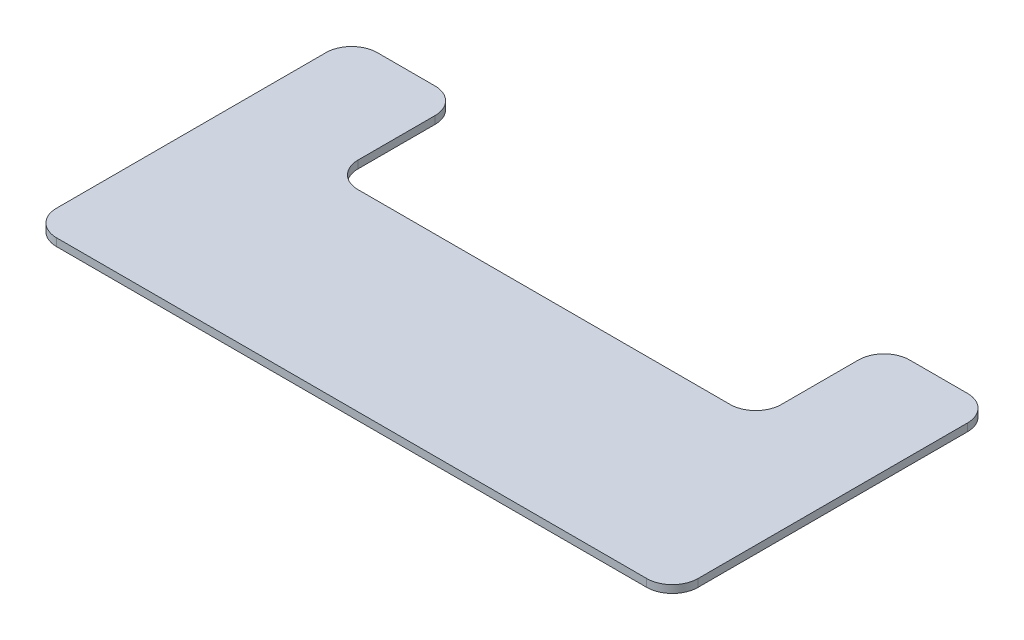
ISO-10303-21;
HEADER;
FILE_DESCRIPTION(('STEP AP214'),'2;1');
FILE_NAME('part.step','',(''),(''),'','','');
FILE_SCHEMA(('AUTOMOTIVE_DESIGN { 1 0 10303 214 1 1 1 1 }'));
ENDSEC;
DATA;
#1=APPLICATION_CONTEXT('core data for automotive mechanical design processes');
#2=APPLICATION_PROTOCOL_DEFINITION('international standard','automotive_design',2000,#1);
#3=PRODUCT_CONTEXT('',#1,'mechanical');
#4=PRODUCT('Part','Part','',(#3));
#5=PRODUCT_RELATED_PRODUCT_CATEGORY('part','',(#4));
#6=PRODUCT_DEFINITION_FORMATION('','',#4);
#7=PRODUCT_DEFINITION_CONTEXT('part definition',#1,'design');
#8=PRODUCT_DEFINITION('design','',#6,#7);
#9=PRODUCT_DEFINITION_SHAPE('','',#8);
#10=(LENGTH_UNIT() NAMED_UNIT(*) SI_UNIT(.MILLI.,.METRE.));
#11=(NAMED_UNIT(*) PLANE_ANGLE_UNIT() SI_UNIT($,.RADIAN.));
#12=(NAMED_UNIT(*) SI_UNIT($,.STERADIAN.) SOLID_ANGLE_UNIT());
#13=UNCERTAINTY_MEASURE_WITH_UNIT(LENGTH_MEASURE(1.E-05),#10,'distance_accuracy_value','');
#14=(GEOMETRIC_REPRESENTATION_CONTEXT(3) GLOBAL_UNCERTAINTY_ASSIGNED_CONTEXT((#13)) GLOBAL_UNIT_ASSIGNED_CONTEXT((#10,
#11,#12)) REPRESENTATION_CONTEXT('',''));
#15=CARTESIAN_POINT('',(0.,0.,0.));
#16=DIRECTION('',(0.,0.,1.));
#17=DIRECTION('',(1.,0.,0.));
#18=AXIS2_PLACEMENT_3D('',#15,#16,#17);
#19=CARTESIAN_POINT('',(72.5,-3.,-85.));
#20=DIRECTION('',(0.,1.,0.));
#21=DIRECTION('',(0.,0.,1.));
#22=AXIS2_PLACEMENT_3D('',#19,#20,#21);
#23=CYLINDRICAL_SURFACE('',#22,9.99999999999998);
#24=CARTESIAN_POINT('',(72.5,0.,-85.));
#25=DIRECTION('',(0.,-1.,0.));
#26=DIRECTION('',(0.,0.,1.));
#27=AXIS2_PLACEMENT_3D('',#24,#25,#26);
#28=CIRCLE('',#27,9.99999999999998);
#29=CARTESIAN_POINT('',(82.5,0.,-85.));
#30=VERTEX_POINT('',#29);
#31=CARTESIAN_POINT('',(72.5,0.,-75.));
#32=VERTEX_POINT('',#31);
#33=EDGE_CURVE('E224',#30,#32,#28,.T.);
#34=ORIENTED_EDGE('',*,*,#33,.F.);
#35=DIRECTION('',(0.,1.,0.));
#36=VECTOR('',#35,1.);
#37=CARTESIAN_POINT('',(82.5,-3.,-85.));
#38=LINE('',#37,#36);
#39=CARTESIAN_POINT('',(82.5,-3.,-85.));
#40=VERTEX_POINT('',#39);
#41=EDGE_CURVE('E51',#40,#30,#38,.T.);
#42=ORIENTED_EDGE('',*,*,#41,.F.);
#43=CARTESIAN_POINT('',(72.5,-3.,-85.));
#44=DIRECTION('',(0.,-1.,0.));
#45=DIRECTION('',(0.,0.,1.));
#46=AXIS2_PLACEMENT_3D('',#43,#44,#45);
#47=CIRCLE('',#46,9.99999999999998);
#48=CARTESIAN_POINT('',(72.5,-3.,-75.));
#49=VERTEX_POINT('',#48);
#50=EDGE_CURVE('E174',#40,#49,#47,.T.);
#51=ORIENTED_EDGE('',*,*,#50,.T.);
#52=DIRECTION('',(0.,1.,0.));
#53=VECTOR('',#52,1.);
#54=CARTESIAN_POINT('',(72.5,-3.,-75.));
#55=LINE('',#54,#53);
#56=EDGE_CURVE('E11',#49,#32,#55,.T.);
#57=ORIENTED_EDGE('',*,*,#56,.T.);
#58=EDGE_LOOP('',(#34,#42,#51,#57));
#59=FACE_BOUND('',#58,.T.);
#60=ADVANCED_FACE('F41',(#59),#23,.F.);
#61=CARTESIAN_POINT('',(82.5,-3.,-85.));
#62=DIRECTION('',(-1.,0.,0.));
#63=DIRECTION('',(0.,0.,1.));
#64=AXIS2_PLACEMENT_3D('',#61,#62,#63);
#65=PLANE('',#64);
#66=DIRECTION('',(0.,0.,1.));
#67=VECTOR('',#66,1.);
#68=CARTESIAN_POINT('',(82.5,0.,-85.));
#69=LINE('',#68,#67);
#70=CARTESIAN_POINT('',(82.5,0.,-115.));
#71=VERTEX_POINT('',#70);
#72=EDGE_CURVE('E160',#71,#30,#69,.T.);
#73=ORIENTED_EDGE('',*,*,#72,.F.);
#74=DIRECTION('',(0.,1.,0.));
#75=VECTOR('',#74,1.);
#76=CARTESIAN_POINT('',(82.5,-3.,-115.));
#77=LINE('',#76,#75);
#78=CARTESIAN_POINT('',(82.5,-3.,-115.));
#79=VERTEX_POINT('',#78);
#80=EDGE_CURVE('E155',#79,#71,#77,.T.);
#81=ORIENTED_EDGE('',*,*,#80,.F.);
#82=DIRECTION('',(0.,0.,1.));
#83=VECTOR('',#82,1.);
#84=CARTESIAN_POINT('',(82.5,-3.,-85.));
#85=LINE('',#84,#83);
#86=EDGE_CURVE('E158',#79,#40,#85,.T.);
#87=ORIENTED_EDGE('',*,*,#86,.T.);
#88=ORIENTED_EDGE('',*,*,#41,.T.);
#89=EDGE_LOOP('',(#73,#81,#87,#88));
#90=FACE_BOUND('',#89,.T.);
#91=ADVANCED_FACE('F157',(#90),#65,.T.);
#92=CARTESIAN_POINT('',(92.5,-3.,-115.));
#93=DIRECTION('',(0.,1.,0.));
#94=DIRECTION('',(0.,0.,1.));
#95=AXIS2_PLACEMENT_3D('',#92,#93,#94);
#96=CYLINDRICAL_SURFACE('',#95,10.);
#97=CARTESIAN_POINT('',(92.5,0.,-115.));
#98=DIRECTION('',(0.,1.,0.));
#99=DIRECTION('',(0.,0.,1.));
#100=AXIS2_PLACEMENT_3D('',#97,#98,#99);
#101=CIRCLE('',#100,10.);
#102=CARTESIAN_POINT('',(92.5,0.,-125.));
#103=VERTEX_POINT('',#102);
#104=EDGE_CURVE('E221',#103,#71,#101,.T.);
#105=ORIENTED_EDGE('',*,*,#104,.F.);
#106=DIRECTION('',(0.,1.,0.));
#107=VECTOR('',#106,1.);
#108=CARTESIAN_POINT('',(92.5,-3.,-125.));
#109=LINE('',#108,#107);
#110=CARTESIAN_POINT('',(92.5,-3.,-125.));
#111=VERTEX_POINT('',#110);
#112=EDGE_CURVE('E165',#111,#103,#109,.T.);
#113=ORIENTED_EDGE('',*,*,#112,.F.);
#114=CARTESIAN_POINT('',(92.5,-3.,-115.));
#115=DIRECTION('',(0.,1.,0.));
#116=DIRECTION('',(0.,0.,1.));
#117=AXIS2_PLACEMENT_3D('',#114,#115,#116);
#118=CIRCLE('',#117,10.);
#119=EDGE_CURVE('E171',#111,#79,#118,.T.);
#120=ORIENTED_EDGE('',*,*,#119,.T.);
#121=ORIENTED_EDGE('',*,*,#80,.T.);
#122=EDGE_LOOP('',(#105,#113,#120,#121));
#123=FACE_BOUND('',#122,.T.);
#124=ADVANCED_FACE('F176',(#123),#96,.T.);
#125=CARTESIAN_POINT('',(115.,-3.,-125.));
#126=DIRECTION('',(0.,0.,-1.));
#127=DIRECTION('',(-1.,0.,0.));
#128=AXIS2_PLACEMENT_3D('',#125,#126,#127);
#129=PLANE('',#128);
#130=DIRECTION('',(-1.,0.,0.));
#131=VECTOR('',#130,1.);
#132=CARTESIAN_POINT('',(115.,0.,-125.));
#133=LINE('',#132,#131);
#134=CARTESIAN_POINT('',(115.,0.,-125.));
#135=VERTEX_POINT('',#134);
#136=EDGE_CURVE('E218',#135,#103,#133,.T.);
#137=ORIENTED_EDGE('',*,*,#136,.F.);
#138=DIRECTION('',(0.,1.,0.));
#139=VECTOR('',#138,1.);
#140=CARTESIAN_POINT('',(115.,-3.,-125.));
#141=LINE('',#140,#139);
#142=CARTESIAN_POINT('',(115.,-3.,-125.));
#143=VERTEX_POINT('',#142);
#144=EDGE_CURVE('E229',#143,#135,#141,.T.);
#145=ORIENTED_EDGE('',*,*,#144,.F.);
#146=DIRECTION('',(-1.,0.,0.));
#147=VECTOR('',#146,1.);
#148=CARTESIAN_POINT('',(115.,-3.,-125.));
#149=LINE('',#148,#147);
#150=EDGE_CURVE('E177',#143,#111,#149,.T.);
#151=ORIENTED_EDGE('',*,*,#150,.T.);
#152=ORIENTED_EDGE('',*,*,#112,.T.);
#153=EDGE_LOOP('',(#137,#145,#151,#152));
#154=FACE_BOUND('',#153,.T.);
#155=ADVANCED_FACE('F272',(#154),#129,.T.);
#156=CARTESIAN_POINT('',(115.,-3.,-115.));
#157=DIRECTION('',(0.,1.,0.));
#158=DIRECTION('',(0.,0.,1.));
#159=AXIS2_PLACEMENT_3D('',#156,#157,#158);
#160=CYLINDRICAL_SURFACE('',#159,9.99999999999999);
#161=CARTESIAN_POINT('',(115.,0.,-115.));
#162=DIRECTION('',(0.,1.,0.));
#163=DIRECTION('',(0.,0.,1.));
#164=AXIS2_PLACEMENT_3D('',#161,#162,#163);
#165=CIRCLE('',#164,9.99999999999999);
#166=CARTESIAN_POINT('',(125.,0.,-115.));
#167=VERTEX_POINT('',#166);
#168=EDGE_CURVE('E215',#167,#135,#165,.T.);
#169=ORIENTED_EDGE('',*,*,#168,.F.);
#170=DIRECTION('',(0.,1.,0.));
#171=VECTOR('',#170,1.);
#172=CARTESIAN_POINT('',(125.,-3.,-115.));
#173=LINE('',#172,#171);
#174=CARTESIAN_POINT('',(125.,-3.,-115.));
#175=VERTEX_POINT('',#174);
#176=EDGE_CURVE('E231',#175,#167,#173,.T.);
#177=ORIENTED_EDGE('',*,*,#176,.F.);
#178=CARTESIAN_POINT('',(115.,-3.,-115.));
#179=DIRECTION('',(0.,1.,0.));
#180=DIRECTION('',(0.,0.,1.));
#181=AXIS2_PLACEMENT_3D('',#178,#179,#180);
#182=CIRCLE('',#181,9.99999999999999);
#183=EDGE_CURVE('E179',#175,#143,#182,.T.);
#184=ORIENTED_EDGE('',*,*,#183,.T.);
#185=ORIENTED_EDGE('',*,*,#144,.T.);
#186=EDGE_LOOP('',(#169,#177,#184,#185));
#187=FACE_BOUND('',#186,.T.);
#188=ADVANCED_FACE('F275',(#187),#160,.T.);
#189=CARTESIAN_POINT('',(125.,-3.,-75.));
#190=DIRECTION('',(1.,0.,0.));
#191=DIRECTION('',(0.,0.,-1.));
#192=AXIS2_PLACEMENT_3D('',#189,#190,#191);
#193=PLANE('',#192);
#194=DIRECTION('',(0.,0.,-1.));
#195=VECTOR('',#194,1.);
#196=CARTESIAN_POINT('',(125.,0.,-75.));
#197=LINE('',#196,#195);
#198=CARTESIAN_POINT('',(125.,0.,-9.99999999999998));
#199=VERTEX_POINT('',#198);
#200=EDGE_CURVE('E212',#199,#167,#197,.T.);
#201=ORIENTED_EDGE('',*,*,#200,.F.);
#202=DIRECTION('',(0.,1.,0.));
#203=VECTOR('',#202,1.);
#204=CARTESIAN_POINT('',(125.,-3.,-9.99999999999998));
#205=LINE('',#204,#203);
#206=CARTESIAN_POINT('',(125.,-3.,-9.99999999999998));
#207=VERTEX_POINT('',#206);
#208=EDGE_CURVE('E233',#207,#199,#205,.T.);
#209=ORIENTED_EDGE('',*,*,#208,.F.);
#210=DIRECTION('',(0.,0.,-1.));
#211=VECTOR('',#210,1.);
#212=CARTESIAN_POINT('',(125.,-3.,-9.99999999999998));
#213=LINE('',#212,#211);
#214=EDGE_CURVE('E514',#207,#175,#213,.T.);
#215=ORIENTED_EDGE('',*,*,#214,.T.);
#216=ORIENTED_EDGE('',*,*,#176,.T.);
#217=EDGE_LOOP('',(#201,#209,#215,#216));
#218=FACE_BOUND('',#217,.T.);
#219=ADVANCED_FACE('F279',(#218),#193,.T.);
#220=CARTESIAN_POINT('',(115.,-3.,-9.99999999999998));
#221=DIRECTION('',(0.,1.,0.));
#222=DIRECTION('',(0.,0.,1.));
#223=AXIS2_PLACEMENT_3D('',#220,#221,#222);
#224=CYLINDRICAL_SURFACE('',#223,10.);
#225=CARTESIAN_POINT('',(115.,0.,-9.99999999999998));
#226=DIRECTION('',(0.,1.,0.));
#227=DIRECTION('',(0.,0.,1.));
#228=AXIS2_PLACEMENT_3D('',#225,#226,#227);
#229=CIRCLE('',#228,10.);
#230=CARTESIAN_POINT('',(115.,0.,0.));
#231=VERTEX_POINT('',#230);
#232=EDGE_CURVE('E209',#231,#199,#229,.T.);
#233=ORIENTED_EDGE('',*,*,#232,.F.);
#234=DIRECTION('',(0.,1.,0.));
#235=VECTOR('',#234,1.);
#236=CARTESIAN_POINT('',(115.,-3.,0.));
#237=LINE('',#236,#235);
#238=CARTESIAN_POINT('',(115.,-3.,0.));
#239=VERTEX_POINT('',#238);
#240=EDGE_CURVE('E236',#239,#231,#237,.T.);
#241=ORIENTED_EDGE('',*,*,#240,.F.);
#242=CARTESIAN_POINT('',(115.,-3.,-9.99999999999998));
#243=DIRECTION('',(0.,1.,0.));
#244=DIRECTION('',(0.,0.,1.));
#245=AXIS2_PLACEMENT_3D('',#242,#243,#244);
#246=CIRCLE('',#245,10.);
#247=EDGE_CURVE('E512',#239,#207,#246,.T.);
#248=ORIENTED_EDGE('',*,*,#247,.T.);
#249=ORIENTED_EDGE('',*,*,#208,.T.);
#250=EDGE_LOOP('',(#233,#241,#248,#249));
#251=FACE_BOUND('',#250,.T.);
#252=ADVANCED_FACE('F283',(#251),#224,.T.);
#253=CARTESIAN_POINT('',(50.,-3.,0.));
#254=DIRECTION('',(0.,0.,1.));
#255=DIRECTION('',(1.,0.,0.));
#256=AXIS2_PLACEMENT_3D('',#253,#254,#255);
#257=PLANE('',#256);
#258=DIRECTION('',(1.,0.,0.));
#259=VECTOR('',#258,1.);
#260=CARTESIAN_POINT('',(50.,0.,0.));
#261=LINE('',#260,#259);
#262=CARTESIAN_POINT('',(-115.,0.,0.));
#263=VERTEX_POINT('',#262);
#264=EDGE_CURVE('E206',#263,#231,#261,.T.);
#265=ORIENTED_EDGE('',*,*,#264,.F.);
#266=DIRECTION('',(0.,1.,0.));
#267=VECTOR('',#266,1.);
#268=CARTESIAN_POINT('',(-115.,-3.,0.));
#269=LINE('',#268,#267);
#270=CARTESIAN_POINT('',(-115.,-3.,0.));
#271=VERTEX_POINT('',#270);
#272=EDGE_CURVE('E238',#271,#263,#269,.T.);
#273=ORIENTED_EDGE('',*,*,#272,.F.);
#274=DIRECTION('',(1.,0.,0.));
#275=VECTOR('',#274,1.);
#276=CARTESIAN_POINT('',(-50.,-3.,0.));
#277=LINE('',#276,#275);
#278=EDGE_CURVE('E507',#271,#239,#277,.T.);
#279=ORIENTED_EDGE('',*,*,#278,.T.);
#280=ORIENTED_EDGE('',*,*,#240,.T.);
#281=EDGE_LOOP('',(#265,#273,#279,#280));
#282=FACE_BOUND('',#281,.T.);
#283=ADVANCED_FACE('F287',(#282),#257,.T.);
#284=CARTESIAN_POINT('',(-115.,-3.,-9.99999999999998));
#285=DIRECTION('',(0.,1.,0.));
#286=DIRECTION('',(0.,0.,1.));
#287=AXIS2_PLACEMENT_3D('',#284,#285,#286);
#288=CYLINDRICAL_SURFACE('',#287,10.);
#289=CARTESIAN_POINT('',(-115.,0.,-9.99999999999998));
#290=DIRECTION('',(0.,1.,0.));
#291=DIRECTION('',(0.,0.,-1.));
#292=AXIS2_PLACEMENT_3D('',#289,#290,#291);
#293=CIRCLE('',#292,10.);
#294=CARTESIAN_POINT('',(-125.,0.,-9.99999999999998));
#295=VERTEX_POINT('',#294);
#296=EDGE_CURVE('E203',#295,#263,#293,.T.);
#297=ORIENTED_EDGE('',*,*,#296,.F.);
#298=DIRECTION('',(0.,1.,0.));
#299=VECTOR('',#298,1.);
#300=CARTESIAN_POINT('',(-125.,-3.,-9.99999999999998));
#301=LINE('',#300,#299);
#302=CARTESIAN_POINT('',(-125.,-3.,-9.99999999999998));
#303=VERTEX_POINT('',#302);
#304=EDGE_CURVE('E241',#303,#295,#301,.T.);
#305=ORIENTED_EDGE('',*,*,#304,.F.);
#306=CARTESIAN_POINT('',(-115.,-3.,-9.99999999999998));
#307=DIRECTION('',(0.,1.,0.));
#308=DIRECTION('',(0.,0.,-1.));
#309=AXIS2_PLACEMENT_3D('',#306,#307,#308);
#310=CIRCLE('',#309,10.);
#311=EDGE_CURVE('E505',#303,#271,#310,.T.);
#312=ORIENTED_EDGE('',*,*,#311,.T.);
#313=ORIENTED_EDGE('',*,*,#272,.T.);
#314=EDGE_LOOP('',(#297,#305,#312,#313));
#315=FACE_BOUND('',#314,.T.);
#316=ADVANCED_FACE('F291',(#315),#288,.T.);
#317=CARTESIAN_POINT('',(-125.,-3.,-9.99999999999998));
#318=DIRECTION('',(-1.,0.,0.));
#319=DIRECTION('',(0.,0.,1.));
#320=AXIS2_PLACEMENT_3D('',#317,#318,#319);
#321=PLANE('',#320);
#322=DIRECTION('',(0.,0.,1.));
#323=VECTOR('',#322,1.);
#324=CARTESIAN_POINT('',(-125.,0.,-9.99999999999998));
#325=LINE('',#324,#323);
#326=CARTESIAN_POINT('',(-125.,0.,-115.));
#327=VERTEX_POINT('',#326);
#328=EDGE_CURVE('E200',#327,#295,#325,.T.);
#329=ORIENTED_EDGE('',*,*,#328,.F.);
#330=DIRECTION('',(0.,1.,0.));
#331=VECTOR('',#330,1.);
#332=CARTESIAN_POINT('',(-125.,-3.,-115.));
#333=LINE('',#332,#331);
#334=CARTESIAN_POINT('',(-125.,-3.,-115.));
#335=VERTEX_POINT('',#334);
#336=EDGE_CURVE('E243',#335,#327,#333,.T.);
#337=ORIENTED_EDGE('',*,*,#336,.F.);
#338=DIRECTION('',(0.,0.,1.));
#339=VECTOR('',#338,1.);
#340=CARTESIAN_POINT('',(-125.,-3.,-75.));
#341=LINE('',#340,#339);
#342=EDGE_CURVE('E502',#335,#303,#341,.T.);
#343=ORIENTED_EDGE('',*,*,#342,.T.);
#344=ORIENTED_EDGE('',*,*,#304,.T.);
#345=EDGE_LOOP('',(#329,#337,#343,#344));
#346=FACE_BOUND('',#345,.T.);
#347=ADVANCED_FACE('F295',(#346),#321,.T.);
#348=CARTESIAN_POINT('',(-115.,-3.,-115.));
#349=DIRECTION('',(0.,1.,0.));
#350=DIRECTION('',(0.,0.,1.));
#351=AXIS2_PLACEMENT_3D('',#348,#349,#350);
#352=CYLINDRICAL_SURFACE('',#351,9.99999999999999);
#353=CARTESIAN_POINT('',(-115.,0.,-115.));
#354=DIRECTION('',(0.,1.,0.));
#355=DIRECTION('',(0.,0.,-1.));
#356=AXIS2_PLACEMENT_3D('',#353,#354,#355);
#357=CIRCLE('',#356,9.99999999999999);
#358=CARTESIAN_POINT('',(-115.,0.,-125.));
#359=VERTEX_POINT('',#358);
#360=EDGE_CURVE('E197',#359,#327,#357,.T.);
#361=ORIENTED_EDGE('',*,*,#360,.F.);
#362=DIRECTION('',(0.,1.,0.));
#363=VECTOR('',#362,1.);
#364=CARTESIAN_POINT('',(-115.,-3.,-125.));
#365=LINE('',#364,#363);
#366=CARTESIAN_POINT('',(-115.,-3.,-125.));
#367=VERTEX_POINT('',#366);
#368=EDGE_CURVE('E246',#367,#359,#365,.T.);
#369=ORIENTED_EDGE('',*,*,#368,.F.);
#370=CARTESIAN_POINT('',(-115.,-3.,-115.));
#371=DIRECTION('',(0.,1.,0.));
#372=DIRECTION('',(0.,0.,-1.));
#373=AXIS2_PLACEMENT_3D('',#370,#371,#372);
#374=CIRCLE('',#373,9.99999999999999);
#375=EDGE_CURVE('E526',#367,#335,#374,.T.);
#376=ORIENTED_EDGE('',*,*,#375,.T.);
#377=ORIENTED_EDGE('',*,*,#336,.T.);
#378=EDGE_LOOP('',(#361,#369,#376,#377));
#379=FACE_BOUND('',#378,.T.);
#380=ADVANCED_FACE('F299',(#379),#352,.T.);
#381=CARTESIAN_POINT('',(-115.,-3.,-125.));
#382=DIRECTION('',(0.,0.,-1.));
#383=DIRECTION('',(-1.,0.,0.));
#384=AXIS2_PLACEMENT_3D('',#381,#382,#383);
#385=PLANE('',#384);
#386=DIRECTION('',(-1.,0.,0.));
#387=VECTOR('',#386,1.);
#388=CARTESIAN_POINT('',(-115.,0.,-125.));
#389=LINE('',#388,#387);
#390=CARTESIAN_POINT('',(-92.5,0.,-125.));
#391=VERTEX_POINT('',#390);
#392=EDGE_CURVE('E194',#391,#359,#389,.T.);
#393=ORIENTED_EDGE('',*,*,#392,.F.);
#394=DIRECTION('',(0.,1.,0.));
#395=VECTOR('',#394,1.);
#396=CARTESIAN_POINT('',(-92.5,-3.,-125.));
#397=LINE('',#396,#395);
#398=CARTESIAN_POINT('',(-92.5,-3.,-125.));
#399=VERTEX_POINT('',#398);
#400=EDGE_CURVE('E248',#399,#391,#397,.T.);
#401=ORIENTED_EDGE('',*,*,#400,.F.);
#402=DIRECTION('',(-1.,0.,0.));
#403=VECTOR('',#402,1.);
#404=CARTESIAN_POINT('',(-115.,-3.,-125.));
#405=LINE('',#404,#403);
#406=EDGE_CURVE('E496',#399,#367,#405,.T.);
#407=ORIENTED_EDGE('',*,*,#406,.T.);
#408=ORIENTED_EDGE('',*,*,#368,.T.);
#409=EDGE_LOOP('',(#393,#401,#407,#408));
#410=FACE_BOUND('',#409,.T.);
#411=ADVANCED_FACE('F303',(#410),#385,.T.);
#412=CARTESIAN_POINT('',(-92.5,-3.,-115.));
#413=DIRECTION('',(0.,1.,0.));
#414=DIRECTION('',(0.,0.,1.));
#415=AXIS2_PLACEMENT_3D('',#412,#413,#414);
#416=CYLINDRICAL_SURFACE('',#415,10.);
#417=CARTESIAN_POINT('',(-92.5,0.,-115.));
#418=DIRECTION('',(0.,1.,0.));
#419=DIRECTION('',(0.,0.,-1.));
#420=AXIS2_PLACEMENT_3D('',#417,#418,#419);
#421=CIRCLE('',#420,10.);
#422=CARTESIAN_POINT('',(-82.5,0.,-115.));
#423=VERTEX_POINT('',#422);
#424=EDGE_CURVE('E191',#423,#391,#421,.T.);
#425=ORIENTED_EDGE('',*,*,#424,.F.);
#426=DIRECTION('',(0.,1.,0.));
#427=VECTOR('',#426,1.);
#428=CARTESIAN_POINT('',(-82.5,-3.,-115.));
#429=LINE('',#428,#427);
#430=CARTESIAN_POINT('',(-82.5,-3.,-115.));
#431=VERTEX_POINT('',#430);
#432=EDGE_CURVE('E250',#431,#423,#429,.T.);
#433=ORIENTED_EDGE('',*,*,#432,.F.);
#434=CARTESIAN_POINT('',(-92.5,-3.,-115.));
#435=DIRECTION('',(0.,1.,0.));
#436=DIRECTION('',(0.,0.,-1.));
#437=AXIS2_PLACEMENT_3D('',#434,#435,#436);
#438=CIRCLE('',#437,10.);
#439=EDGE_CURVE('E492',#431,#399,#438,.T.);
#440=ORIENTED_EDGE('',*,*,#439,.T.);
#441=ORIENTED_EDGE('',*,*,#400,.T.);
#442=EDGE_LOOP('',(#425,#433,#440,#441));
#443=FACE_BOUND('',#442,.T.);
#444=ADVANCED_FACE('F307',(#443),#416,.T.);
#445=CARTESIAN_POINT('',(-82.5,-3.,-85.));
#446=DIRECTION('',(1.,0.,0.));
#447=DIRECTION('',(0.,0.,-1.));
#448=AXIS2_PLACEMENT_3D('',#445,#446,#447);
#449=PLANE('',#448);
#450=DIRECTION('',(0.,0.,-1.));
#451=VECTOR('',#450,1.);
#452=CARTESIAN_POINT('',(-82.5,0.,-85.));
#453=LINE('',#452,#451);
#454=CARTESIAN_POINT('',(-82.5,0.,-85.));
#455=VERTEX_POINT('',#454);
#456=EDGE_CURVE('E188',#455,#423,#453,.T.);
#457=ORIENTED_EDGE('',*,*,#456,.F.);
#458=DIRECTION('',(0.,1.,0.));
#459=VECTOR('',#458,1.);
#460=CARTESIAN_POINT('',(-82.5,-3.,-85.));
#461=LINE('',#460,#459);
#462=CARTESIAN_POINT('',(-82.5,-3.,-85.));
#463=VERTEX_POINT('',#462);
#464=EDGE_CURVE('E251',#463,#455,#461,.T.);
#465=ORIENTED_EDGE('',*,*,#464,.F.);
#466=DIRECTION('',(0.,0.,-1.));
#467=VECTOR('',#466,1.);
#468=CARTESIAN_POINT('',(-82.5,-3.,-85.));
#469=LINE('',#468,#467);
#470=EDGE_CURVE('E530',#463,#431,#469,.T.);
#471=ORIENTED_EDGE('',*,*,#470,.T.);
#472=ORIENTED_EDGE('',*,*,#432,.T.);
#473=EDGE_LOOP('',(#457,#465,#471,#472));
#474=FACE_BOUND('',#473,.T.);
#475=ADVANCED_FACE('F311',(#474),#449,.T.);
#476=CARTESIAN_POINT('',(-72.5,-3.,-85.));
#477=DIRECTION('',(0.,1.,0.));
#478=DIRECTION('',(0.,0.,1.));
#479=AXIS2_PLACEMENT_3D('',#476,#477,#478);
#480=CYLINDRICAL_SURFACE('',#479,9.99999999999998);
#481=CARTESIAN_POINT('',(-72.5,0.,-85.));
#482=DIRECTION('',(0.,-1.,0.));
#483=DIRECTION('',(0.,0.,1.));
#484=AXIS2_PLACEMENT_3D('',#481,#482,#483);
#485=CIRCLE('',#484,9.99999999999998);
#486=CARTESIAN_POINT('',(-72.5,0.,-75.));
#487=VERTEX_POINT('',#486);
#488=EDGE_CURVE('E185',#487,#455,#485,.T.);
#489=ORIENTED_EDGE('',*,*,#488,.F.);
#490=DIRECTION('',(0.,1.,0.));
#491=VECTOR('',#490,1.);
#492=CARTESIAN_POINT('',(-72.5,-3.,-75.));
#493=LINE('',#492,#491);
#494=CARTESIAN_POINT('',(-72.5,-3.,-75.));
#495=VERTEX_POINT('',#494);
#496=EDGE_CURVE('E45',#495,#487,#493,.T.);
#497=ORIENTED_EDGE('',*,*,#496,.F.);
#498=CARTESIAN_POINT('',(-72.5,-3.,-85.));
#499=DIRECTION('',(0.,-1.,0.));
#500=DIRECTION('',(0.,0.,1.));
#501=AXIS2_PLACEMENT_3D('',#498,#499,#500);
#502=CIRCLE('',#501,9.99999999999998);
#503=EDGE_CURVE('E532',#495,#463,#502,.T.);
#504=ORIENTED_EDGE('',*,*,#503,.T.);
#505=ORIENTED_EDGE('',*,*,#464,.T.);
#506=EDGE_LOOP('',(#489,#497,#504,#505));
#507=FACE_BOUND('',#506,.T.);
#508=ADVANCED_FACE('F258',(#507),#480,.F.);
#509=CARTESIAN_POINT('',(-50.,-3.,-75.));
#510=DIRECTION('',(0.,0.,-1.));
#511=DIRECTION('',(-1.,0.,0.));
#512=AXIS2_PLACEMENT_3D('',#509,#510,#511);
#513=PLANE('',#512);
#514=DIRECTION('',(-1.,0.,0.));
#515=VECTOR('',#514,1.);
#516=CARTESIAN_POINT('',(-50.,0.,-75.));
#517=LINE('',#516,#515);
#518=EDGE_CURVE('E114',#32,#487,#517,.T.);
#519=ORIENTED_EDGE('',*,*,#518,.F.);
#520=ORIENTED_EDGE('',*,*,#56,.F.);
#521=DIRECTION('',(-1.,0.,0.));
#522=VECTOR('',#521,1.);
#523=CARTESIAN_POINT('',(50.,-3.,-75.));
#524=LINE('',#523,#522);
#525=EDGE_CURVE('E117',#49,#495,#524,.T.);
#526=ORIENTED_EDGE('',*,*,#525,.T.);
#527=ORIENTED_EDGE('',*,*,#496,.T.);
#528=EDGE_LOOP('',(#519,#520,#526,#527));
#529=FACE_BOUND('',#528,.T.);
#530=ADVANCED_FACE('F256',(#529),#513,.T.);
#531=CARTESIAN_POINT('',(72.5,-3.,-85.));
#532=DIRECTION('',(0.,1.,0.));
#533=DIRECTION('',(0.,0.,1.));
#534=AXIS2_PLACEMENT_3D('',#531,#532,#533);
#535=PLANE('',#534);
#536=ORIENTED_EDGE('',*,*,#525,.F.);
#537=ORIENTED_EDGE('',*,*,#50,.F.);
#538=ORIENTED_EDGE('',*,*,#86,.F.);
#539=ORIENTED_EDGE('',*,*,#119,.F.);
#540=ORIENTED_EDGE('',*,*,#150,.F.);
#541=ORIENTED_EDGE('',*,*,#183,.F.);
#542=ORIENTED_EDGE('',*,*,#214,.F.);
#543=ORIENTED_EDGE('',*,*,#247,.F.);
#544=ORIENTED_EDGE('',*,*,#278,.F.);
#545=ORIENTED_EDGE('',*,*,#311,.F.);
#546=ORIENTED_EDGE('',*,*,#342,.F.);
#547=ORIENTED_EDGE('',*,*,#375,.F.);
#548=ORIENTED_EDGE('',*,*,#406,.F.);
#549=ORIENTED_EDGE('',*,*,#439,.F.);
#550=ORIENTED_EDGE('',*,*,#470,.F.);
#551=ORIENTED_EDGE('',*,*,#503,.F.);
#552=EDGE_LOOP('',(#536,#537,#538,#539,#540,#541,#542,#543,#544,#545,#546,#547,#548,#549,#550,#551));
#553=FACE_BOUND('',#552,.T.);
#554=ADVANCED_FACE('F169',(#553),#535,.F.);
#555=CARTESIAN_POINT('',(72.5,0.,-85.));
#556=DIRECTION('',(0.,1.,0.));
#557=DIRECTION('',(0.,0.,1.));
#558=AXIS2_PLACEMENT_3D('',#555,#556,#557);
#559=PLANE('',#558);
#560=ORIENTED_EDGE('',*,*,#33,.T.);
#561=ORIENTED_EDGE('',*,*,#518,.T.);
#562=ORIENTED_EDGE('',*,*,#488,.T.);
#563=ORIENTED_EDGE('',*,*,#456,.T.);
#564=ORIENTED_EDGE('',*,*,#424,.T.);
#565=ORIENTED_EDGE('',*,*,#392,.T.);
#566=ORIENTED_EDGE('',*,*,#360,.T.);
#567=ORIENTED_EDGE('',*,*,#328,.T.);
#568=ORIENTED_EDGE('',*,*,#296,.T.);
#569=ORIENTED_EDGE('',*,*,#264,.T.);
#570=ORIENTED_EDGE('',*,*,#232,.T.);
#571=ORIENTED_EDGE('',*,*,#200,.T.);
#572=ORIENTED_EDGE('',*,*,#168,.T.);
#573=ORIENTED_EDGE('',*,*,#136,.T.);
#574=ORIENTED_EDGE('',*,*,#104,.T.);
#575=ORIENTED_EDGE('',*,*,#72,.T.);
#576=EDGE_LOOP('',(#560,#561,#562,#563,#564,#565,#566,#567,#568,#569,#570,#571,#572,#573,#574,#575));
#577=FACE_BOUND('',#576,.T.);
#578=ADVANCED_FACE('F43',(#577),#559,.T.);
#579=CLOSED_SHELL('',(#60,#91,#124,#155,#188,#219,#252,#283,#316,#347,#380,#411,#444,#475,#508,
#530,#554,#578));
#580=MANIFOLD_SOLID_BREP('B2',#579);
#581=ADVANCED_BREP_SHAPE_REPRESENTATION('',(#18,#580),#14);
#582=SHAPE_DEFINITION_REPRESENTATION(#9,#581);
ENDSEC;
END-ISO-10303-21;
